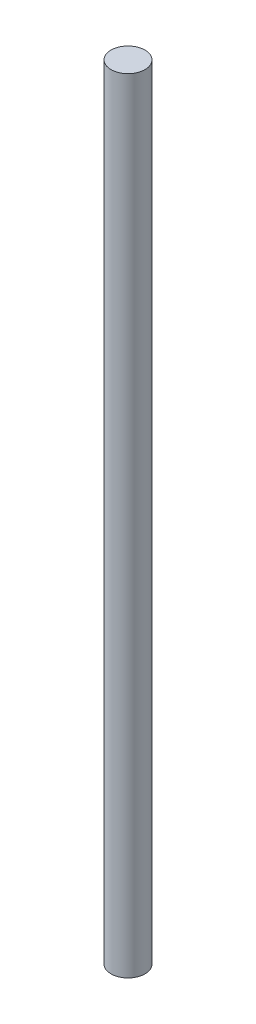
ISO-10303-21;
HEADER;
FILE_DESCRIPTION(('STEP AP214'),'2;1');
FILE_NAME('part.step','',(''),(''),'','','');
FILE_SCHEMA(('AUTOMOTIVE_DESIGN { 1 0 10303 214 1 1 1 1 }'));
ENDSEC;
DATA;
#1=APPLICATION_CONTEXT('core data for automotive mechanical design processes');
#2=APPLICATION_PROTOCOL_DEFINITION('international standard','automotive_design',2000,#1);
#3=PRODUCT_CONTEXT('',#1,'mechanical');
#4=PRODUCT('Part','Part','',(#3));
#5=PRODUCT_RELATED_PRODUCT_CATEGORY('part','',(#4));
#6=PRODUCT_DEFINITION_FORMATION('','',#4);
#7=PRODUCT_DEFINITION_CONTEXT('part definition',#1,'design');
#8=PRODUCT_DEFINITION('design','',#6,#7);
#9=PRODUCT_DEFINITION_SHAPE('','',#8);
#10=(LENGTH_UNIT() NAMED_UNIT(*) SI_UNIT(.MILLI.,.METRE.));
#11=(NAMED_UNIT(*) PLANE_ANGLE_UNIT() SI_UNIT($,.RADIAN.));
#12=(NAMED_UNIT(*) SI_UNIT($,.STERADIAN.) SOLID_ANGLE_UNIT());
#13=UNCERTAINTY_MEASURE_WITH_UNIT(LENGTH_MEASURE(1.E-05),#10,'distance_accuracy_value','');
#14=(GEOMETRIC_REPRESENTATION_CONTEXT(3) GLOBAL_UNCERTAINTY_ASSIGNED_CONTEXT((#13)) GLOBAL_UNIT_ASSIGNED_CONTEXT((#10,
#11,#12)) REPRESENTATION_CONTEXT('',''));
#15=CARTESIAN_POINT('',(0.,0.,0.));
#16=DIRECTION('',(0.,0.,1.));
#17=DIRECTION('',(1.,0.,0.));
#18=AXIS2_PLACEMENT_3D('',#15,#16,#17);
#19=CARTESIAN_POINT('',(0.,76.2,0.));
#20=DIRECTION('',(0.,-1.,0.));
#21=DIRECTION('',(0.,0.,-1.));
#22=AXIS2_PLACEMENT_3D('',#19,#20,#21);
#23=CYLINDRICAL_SURFACE('',#22,1.651);
#24=CARTESIAN_POINT('',(0.,76.2,0.));
#25=DIRECTION('',(0.,1.,0.));
#26=DIRECTION('',(0.,0.,1.));
#27=AXIS2_PLACEMENT_3D('',#24,#25,#26);
#28=CIRCLE('',#27,1.651);
#29=CARTESIAN_POINT('',(0.,76.2,-1.651));
#30=VERTEX_POINT('',#29);
#31=EDGE_CURVE('E10',#30,#30,#28,.T.);
#32=CARTESIAN_POINT('',(0.,0.,0.));
#33=DIRECTION('',(0.,1.,0.));
#34=DIRECTION('',(0.,0.,1.));
#35=AXIS2_PLACEMENT_3D('',#32,#33,#34);
#36=CIRCLE('',#35,1.651);
#37=CARTESIAN_POINT('',(0.,0.,-1.651));
#38=VERTEX_POINT('',#37);
#39=EDGE_CURVE('E34',#38,#38,#36,.T.);
#40=CARTESIAN_POINT('',(0.,76.2,-1.651));
#41=CARTESIAN_POINT('',(0.,75.40625,-1.651));
#42=CARTESIAN_POINT('',(0.,74.6125,-1.651));
#43=CARTESIAN_POINT('',(0.,73.025,-1.651));
#44=CARTESIAN_POINT('',(0.,72.23125,-1.651));
#45=CARTESIAN_POINT('',(0.,70.64375,-1.651));
#46=CARTESIAN_POINT('',(0.,69.85,-1.651));
#47=CARTESIAN_POINT('',(0.,68.2625,-1.651));
#48=CARTESIAN_POINT('',(0.,67.46875,-1.651));
#49=CARTESIAN_POINT('',(0.,65.88125,-1.651));
#50=CARTESIAN_POINT('',(0.,65.0875,-1.651));
#51=CARTESIAN_POINT('',(0.,63.5,-1.651));
#52=CARTESIAN_POINT('',(0.,62.70625,-1.651));
#53=CARTESIAN_POINT('',(0.,61.11875,-1.651));
#54=CARTESIAN_POINT('',(0.,60.325,-1.651));
#55=CARTESIAN_POINT('',(0.,58.7375,-1.651));
#56=CARTESIAN_POINT('',(0.,57.94375,-1.651));
#57=CARTESIAN_POINT('',(0.,56.35625,-1.651));
#58=CARTESIAN_POINT('',(0.,55.5625,-1.651));
#59=CARTESIAN_POINT('',(0.,53.975,-1.651));
#60=CARTESIAN_POINT('',(0.,53.18125,-1.651));
#61=CARTESIAN_POINT('',(0.,51.59375,-1.651));
#62=CARTESIAN_POINT('',(0.,50.8,-1.651));
#63=CARTESIAN_POINT('',(0.,49.2125,-1.651));
#64=CARTESIAN_POINT('',(0.,48.41875,-1.651));
#65=CARTESIAN_POINT('',(0.,46.83125,-1.651));
#66=CARTESIAN_POINT('',(0.,46.0375,-1.651));
#67=CARTESIAN_POINT('',(0.,44.45,-1.651));
#68=CARTESIAN_POINT('',(0.,43.65625,-1.651));
#69=CARTESIAN_POINT('',(0.,42.06875,-1.651));
#70=CARTESIAN_POINT('',(0.,41.275,-1.651));
#71=CARTESIAN_POINT('',(0.,39.6875,-1.651));
#72=CARTESIAN_POINT('',(0.,38.89375,-1.651));
#73=CARTESIAN_POINT('',(0.,37.30625,-1.651));
#74=CARTESIAN_POINT('',(0.,36.5125,-1.651));
#75=CARTESIAN_POINT('',(0.,34.925,-1.651));
#76=CARTESIAN_POINT('',(0.,34.13125,-1.651));
#77=CARTESIAN_POINT('',(0.,32.54375,-1.651));
#78=CARTESIAN_POINT('',(0.,31.75,-1.651));
#79=CARTESIAN_POINT('',(0.,30.1625,-1.651));
#80=CARTESIAN_POINT('',(0.,29.36875,-1.651));
#81=CARTESIAN_POINT('',(0.,27.78125,-1.651));
#82=CARTESIAN_POINT('',(0.,26.9875,-1.651));
#83=CARTESIAN_POINT('',(0.,25.4,-1.651));
#84=CARTESIAN_POINT('',(0.,24.60625,-1.651));
#85=CARTESIAN_POINT('',(0.,23.01875,-1.651));
#86=CARTESIAN_POINT('',(0.,22.225,-1.651));
#87=CARTESIAN_POINT('',(0.,20.6375,-1.651));
#88=CARTESIAN_POINT('',(0.,19.84375,-1.651));
#89=CARTESIAN_POINT('',(0.,18.25625,-1.651));
#90=CARTESIAN_POINT('',(0.,17.4625,-1.651));
#91=CARTESIAN_POINT('',(0.,15.875,-1.651));
#92=CARTESIAN_POINT('',(0.,15.08125,-1.651));
#93=CARTESIAN_POINT('',(0.,13.49375,-1.651));
#94=CARTESIAN_POINT('',(0.,12.7,-1.651));
#95=CARTESIAN_POINT('',(0.,11.1125,-1.651));
#96=CARTESIAN_POINT('',(0.,10.31875,-1.651));
#97=CARTESIAN_POINT('',(0.,8.73125,-1.651));
#98=CARTESIAN_POINT('',(0.,7.93750000000001,-1.651));
#99=CARTESIAN_POINT('',(0.,6.35,-1.651));
#100=CARTESIAN_POINT('',(0.,5.55625,-1.651));
#101=CARTESIAN_POINT('',(0.,3.96875,-1.651));
#102=CARTESIAN_POINT('',(0.,3.175,-1.651));
#103=CARTESIAN_POINT('',(0.,1.5875,-1.651));
#104=CARTESIAN_POINT('',(0.,0.793750000000001,-1.651));
#105=CARTESIAN_POINT('',(0.,0.,-1.651));
#106=B_SPLINE_CURVE_WITH_KNOTS('',3,(#40,#41,#42,#43,#44,#45,#46,#47,#48,#49,#50,#51,#52,#53,
#54,#55,#56,#57,#58,#59,#60,#61,#62,#63,#64,#65,#66,#67,#68,#69,#70,#71,#72,#73,#74,#75,#76,#77,
#78,#79,#80,#81,#82,#83,#84,#85,#86,#87,#88,#89,#90,#91,#92,#93,#94,#95,#96,#97,#98,#99,#100,
#101,#102,#103,#104,#105),.UNSPECIFIED.,.F.,.F.,(4,2,2,2,2,2,2,2,2,2,2,2,2,2,2,2,2,2,2,2,2,2,2,
2,2,2,2,2,2,2,2,2,4),(0.,2.38125,4.7625,7.14375,9.52500000000001,11.90625,14.2875,16.66875,
19.05,21.43125,23.8125,26.19375,28.575,30.95625,33.3375,35.71875,38.1,40.48125,42.8625,45.24375,
47.625,50.00625,52.3875,54.76875,57.15,59.53125,61.9125,64.29375,66.675,69.05625,71.4375,
73.81875,76.2),.UNSPECIFIED.);
#107=EDGE_CURVE('BSEAM31',#30,#38,#106,.T.);
#108=ORIENTED_EDGE('',*,*,#31,.F.);
#109=ORIENTED_EDGE('',*,*,#39,.T.);
#110=ORIENTED_EDGE('',*,*,#107,.T.);
#111=ORIENTED_EDGE('',*,*,#107,.F.);
#112=EDGE_LOOP('',(#108,#110,#109,#111));
#113=FACE_BOUND('',#112,.T.);
#114=ADVANCED_FACE('F31',(#113),#23,.T.);
#115=CARTESIAN_POINT('',(0.,76.2,0.));
#116=DIRECTION('',(0.,1.,0.));
#117=DIRECTION('',(0.,0.,1.));
#118=AXIS2_PLACEMENT_3D('',#115,#116,#117);
#119=PLANE('',#118);
#120=ORIENTED_EDGE('',*,*,#31,.T.);
#121=EDGE_LOOP('',(#120));
#122=FACE_BOUND('',#121,.T.);
#123=ADVANCED_FACE('F46',(#122),#119,.T.);
#124=CARTESIAN_POINT('',(0.,0.,0.));
#125=DIRECTION('',(0.,1.,0.));
#126=DIRECTION('',(0.,0.,1.));
#127=AXIS2_PLACEMENT_3D('',#124,#125,#126);
#128=PLANE('',#127);
#129=ORIENTED_EDGE('',*,*,#39,.F.);
#130=EDGE_LOOP('',(#129));
#131=FACE_BOUND('',#130,.T.);
#132=ADVANCED_FACE('F44',(#131),#128,.F.);
#133=CLOSED_SHELL('',(#114,#123,#132));
#134=MANIFOLD_SOLID_BREP('B2',#133);
#135=ADVANCED_BREP_SHAPE_REPRESENTATION('',(#18,#134),#14);
#136=SHAPE_DEFINITION_REPRESENTATION(#9,#135);
ENDSEC;
END-ISO-10303-21;
